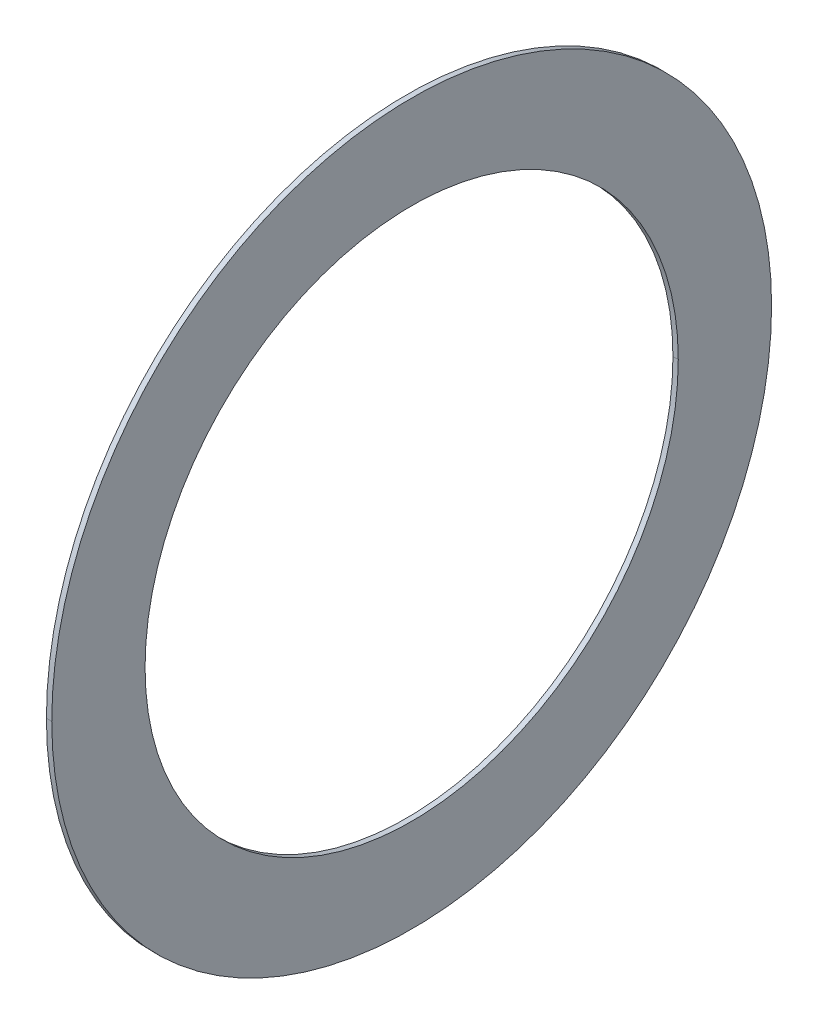
ISO-10303-21;
HEADER;
FILE_DESCRIPTION(('STEP AP214'),'2;1');
FILE_NAME('part.step','',(''),(''),'','','');
FILE_SCHEMA(('AUTOMOTIVE_DESIGN { 1 0 10303 214 1 1 1 1 }'));
ENDSEC;
DATA;
#1=APPLICATION_CONTEXT('core data for automotive mechanical design processes');
#2=APPLICATION_PROTOCOL_DEFINITION('international standard','automotive_design',2000,#1);
#3=PRODUCT_CONTEXT('',#1,'mechanical');
#4=PRODUCT('Part','Part','',(#3));
#5=PRODUCT_RELATED_PRODUCT_CATEGORY('part','',(#4));
#6=PRODUCT_DEFINITION_FORMATION('','',#4);
#7=PRODUCT_DEFINITION_CONTEXT('part definition',#1,'design');
#8=PRODUCT_DEFINITION('design','',#6,#7);
#9=PRODUCT_DEFINITION_SHAPE('','',#8);
#10=(LENGTH_UNIT() NAMED_UNIT(*) SI_UNIT(.MILLI.,.METRE.));
#11=(NAMED_UNIT(*) PLANE_ANGLE_UNIT() SI_UNIT($,.RADIAN.));
#12=(NAMED_UNIT(*) SI_UNIT($,.STERADIAN.) SOLID_ANGLE_UNIT());
#13=UNCERTAINTY_MEASURE_WITH_UNIT(LENGTH_MEASURE(1.E-05),#10,'distance_accuracy_value','');
#14=(GEOMETRIC_REPRESENTATION_CONTEXT(3) GLOBAL_UNCERTAINTY_ASSIGNED_CONTEXT((#13)) GLOBAL_UNIT_ASSIGNED_CONTEXT((#10,
#11,#12)) REPRESENTATION_CONTEXT('',''));
#15=CARTESIAN_POINT('',(0.,0.,0.));
#16=DIRECTION('',(0.,0.,1.));
#17=DIRECTION('',(1.,0.,0.));
#18=AXIS2_PLACEMENT_3D('',#15,#16,#17);
#19=CARTESIAN_POINT('',(2.,67.5,0.));
#20=DIRECTION('',(-1.,0.,0.));
#21=DIRECTION('',(0.,0.,1.));
#22=AXIS2_PLACEMENT_3D('',#19,#20,#21);
#23=PLANE('',#22);
#24=CARTESIAN_POINT('',(2.,0.,0.));
#25=DIRECTION('',(1.,0.,0.));
#26=DIRECTION('',(0.,0.,-1.));
#27=AXIS2_PLACEMENT_3D('',#24,#25,#26);
#28=CIRCLE('',#27,50.);
#29=CARTESIAN_POINT('',(2.,0.,-50.));
#30=VERTEX_POINT('',#29);
#31=CARTESIAN_POINT('',(2.,0.,50.));
#32=VERTEX_POINT('',#31);
#33=EDGE_CURVE('E11',#30,#32,#28,.T.);
#34=ORIENTED_EDGE('',*,*,#33,.T.);
#35=CARTESIAN_POINT('',(2.,0.,0.));
#36=DIRECTION('',(1.,0.,0.));
#37=DIRECTION('',(0.,0.,-1.));
#38=AXIS2_PLACEMENT_3D('',#35,#36,#37);
#39=CIRCLE('',#38,50.);
#40=EDGE_CURVE('E25',#32,#30,#39,.T.);
#41=ORIENTED_EDGE('',*,*,#40,.T.);
#42=EDGE_LOOP('',(#34,#41));
#43=FACE_BOUND('',#42,.T.);
#44=CARTESIAN_POINT('',(2.,0.,0.));
#45=DIRECTION('',(1.,0.,0.));
#46=DIRECTION('',(0.,0.,-1.));
#47=AXIS2_PLACEMENT_3D('',#44,#45,#46);
#48=CIRCLE('',#47,67.5);
#49=CARTESIAN_POINT('',(2.,0.,67.5));
#50=VERTEX_POINT('',#49);
#51=CARTESIAN_POINT('',(2.,0.,-67.5));
#52=VERTEX_POINT('',#51);
#53=EDGE_CURVE('E95',#50,#52,#48,.T.);
#54=ORIENTED_EDGE('',*,*,#53,.F.);
#55=CARTESIAN_POINT('',(2.,0.,0.));
#56=DIRECTION('',(1.,0.,0.));
#57=DIRECTION('',(0.,0.,-1.));
#58=AXIS2_PLACEMENT_3D('',#55,#56,#57);
#59=CIRCLE('',#58,67.5);
#60=EDGE_CURVE('E90',#52,#50,#59,.T.);
#61=ORIENTED_EDGE('',*,*,#60,.F.);
#62=EDGE_LOOP('',(#54,#61));
#63=FACE_BOUND('',#62,.T.);
#64=ADVANCED_FACE('F17',(#43,#63),#23,.T.);
#65=CARTESIAN_POINT('',(50.,0.,0.));
#66=DIRECTION('',(1.,0.,0.));
#67=DIRECTION('',(0.,-1.,0.));
#68=AXIS2_PLACEMENT_3D('',#65,#66,#67);
#69=CYLINDRICAL_SURFACE('',#68,67.5);
#70=DIRECTION('',(1.,0.,0.));
#71=VECTOR('',#70,1.);
#72=CARTESIAN_POINT('',(2.,0.,67.5));
#73=LINE('',#72,#71);
#74=CARTESIAN_POINT('',(3.,0.,67.5));
#75=VERTEX_POINT('',#74);
#76=EDGE_CURVE('E86',#50,#75,#73,.T.);
#77=ORIENTED_EDGE('',*,*,#76,.T.);
#78=CARTESIAN_POINT('',(3.,0.,0.));
#79=DIRECTION('',(1.,0.,0.));
#80=DIRECTION('',(0.,0.,-1.));
#81=AXIS2_PLACEMENT_3D('',#78,#79,#80);
#82=CIRCLE('',#81,67.5);
#83=CARTESIAN_POINT('',(3.,0.,-67.5));
#84=VERTEX_POINT('',#83);
#85=EDGE_CURVE('E81',#84,#75,#82,.T.);
#86=ORIENTED_EDGE('',*,*,#85,.F.);
#87=DIRECTION('',(1.,0.,0.));
#88=VECTOR('',#87,1.);
#89=CARTESIAN_POINT('',(2.,0.,-67.5));
#90=LINE('',#89,#88);
#91=EDGE_CURVE('E70',#52,#84,#90,.T.);
#92=ORIENTED_EDGE('',*,*,#91,.F.);
#93=ORIENTED_EDGE('',*,*,#60,.T.);
#94=EDGE_LOOP('',(#77,#86,#92,#93));
#95=FACE_BOUND('',#94,.T.);
#96=ADVANCED_FACE('F111',(#95),#69,.T.);
#97=CARTESIAN_POINT('',(50.,0.,0.));
#98=DIRECTION('',(1.,0.,0.));
#99=DIRECTION('',(0.,1.,0.));
#100=AXIS2_PLACEMENT_3D('',#97,#98,#99);
#101=CYLINDRICAL_SURFACE('',#100,67.5);
#102=ORIENTED_EDGE('',*,*,#76,.F.);
#103=ORIENTED_EDGE('',*,*,#53,.T.);
#104=ORIENTED_EDGE('',*,*,#91,.T.);
#105=CARTESIAN_POINT('',(3.,0.,0.));
#106=DIRECTION('',(1.,0.,0.));
#107=DIRECTION('',(0.,0.,-1.));
#108=AXIS2_PLACEMENT_3D('',#105,#106,#107);
#109=CIRCLE('',#108,67.5);
#110=EDGE_CURVE('E67',#75,#84,#109,.T.);
#111=ORIENTED_EDGE('',*,*,#110,.F.);
#112=EDGE_LOOP('',(#102,#103,#104,#111));
#113=FACE_BOUND('',#112,.T.);
#114=ADVANCED_FACE('F106',(#113),#101,.T.);
#115=CARTESIAN_POINT('',(3.,50.,0.));
#116=DIRECTION('',(1.,0.,0.));
#117=DIRECTION('',(0.,0.,-1.));
#118=AXIS2_PLACEMENT_3D('',#115,#116,#117);
#119=PLANE('',#118);
#120=ORIENTED_EDGE('',*,*,#85,.T.);
#121=ORIENTED_EDGE('',*,*,#110,.T.);
#122=EDGE_LOOP('',(#120,#121));
#123=FACE_BOUND('',#122,.T.);
#124=CARTESIAN_POINT('',(3.,0.,0.));
#125=DIRECTION('',(1.,0.,0.));
#126=DIRECTION('',(0.,0.,-1.));
#127=AXIS2_PLACEMENT_3D('',#124,#125,#126);
#128=CIRCLE('',#127,50.);
#129=CARTESIAN_POINT('',(3.,0.,50.));
#130=VERTEX_POINT('',#129);
#131=CARTESIAN_POINT('',(3.,0.,-50.));
#132=VERTEX_POINT('',#131);
#133=EDGE_CURVE('E55',#130,#132,#128,.T.);
#134=ORIENTED_EDGE('',*,*,#133,.F.);
#135=CARTESIAN_POINT('',(3.,0.,0.));
#136=DIRECTION('',(1.,0.,0.));
#137=DIRECTION('',(0.,0.,-1.));
#138=AXIS2_PLACEMENT_3D('',#135,#136,#137);
#139=CIRCLE('',#138,50.);
#140=EDGE_CURVE('E51',#132,#130,#139,.T.);
#141=ORIENTED_EDGE('',*,*,#140,.F.);
#142=EDGE_LOOP('',(#134,#141));
#143=FACE_BOUND('',#142,.T.);
#144=ADVANCED_FACE('F53',(#123,#143),#119,.T.);
#145=CARTESIAN_POINT('',(50.,0.,0.));
#146=DIRECTION('',(1.,0.,0.));
#147=DIRECTION('',(0.,-1.,0.));
#148=AXIS2_PLACEMENT_3D('',#145,#146,#147);
#149=CYLINDRICAL_SURFACE('',#148,50.);
#150=DIRECTION('',(1.,0.,0.));
#151=VECTOR('',#150,1.);
#152=CARTESIAN_POINT('',(2.,0.,50.));
#153=LINE('',#152,#151);
#154=EDGE_CURVE('E59',#32,#130,#153,.T.);
#155=ORIENTED_EDGE('',*,*,#154,.F.);
#156=ORIENTED_EDGE('',*,*,#33,.F.);
#157=DIRECTION('',(1.,0.,0.));
#158=VECTOR('',#157,1.);
#159=CARTESIAN_POINT('',(2.,0.,-50.));
#160=LINE('',#159,#158);
#161=EDGE_CURVE('E62',#30,#132,#160,.T.);
#162=ORIENTED_EDGE('',*,*,#161,.T.);
#163=ORIENTED_EDGE('',*,*,#140,.T.);
#164=EDGE_LOOP('',(#155,#156,#162,#163));
#165=FACE_BOUND('',#164,.T.);
#166=ADVANCED_FACE('F63',(#165),#149,.F.);
#167=CARTESIAN_POINT('',(50.,0.,0.));
#168=DIRECTION('',(1.,0.,0.));
#169=DIRECTION('',(0.,1.,0.));
#170=AXIS2_PLACEMENT_3D('',#167,#168,#169);
#171=CYLINDRICAL_SURFACE('',#170,50.);
#172=ORIENTED_EDGE('',*,*,#154,.T.);
#173=ORIENTED_EDGE('',*,*,#133,.T.);
#174=ORIENTED_EDGE('',*,*,#161,.F.);
#175=ORIENTED_EDGE('',*,*,#40,.F.);
#176=EDGE_LOOP('',(#172,#173,#174,#175));
#177=FACE_BOUND('',#176,.T.);
#178=ADVANCED_FACE('F66',(#177),#171,.F.);
#179=CLOSED_SHELL('',(#64,#96,#114,#144,#166,#178));
#180=MANIFOLD_SOLID_BREP('B1',#179);
#181=ADVANCED_BREP_SHAPE_REPRESENTATION('',(#18,#180),#14);
#182=SHAPE_DEFINITION_REPRESENTATION(#9,#181);
ENDSEC;
END-ISO-10303-21;
